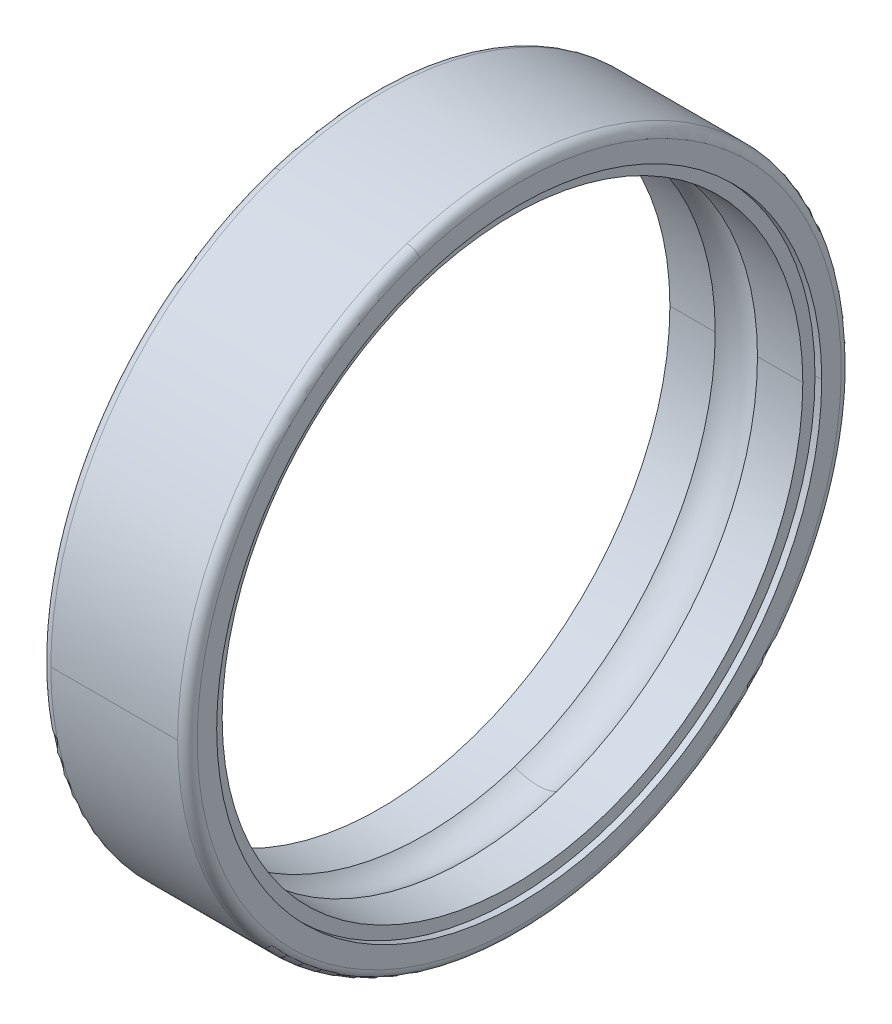
ISO-10303-21;
HEADER;
FILE_DESCRIPTION(('STEP AP214'),'2;1');
FILE_NAME('part.step','',(''),(''),'','','');
FILE_SCHEMA(('AUTOMOTIVE_DESIGN { 1 0 10303 214 1 1 1 1 }'));
ENDSEC;
DATA;
#1=APPLICATION_CONTEXT('core data for automotive mechanical design processes');
#2=APPLICATION_PROTOCOL_DEFINITION('international standard','automotive_design',2000,#1);
#3=PRODUCT_CONTEXT('',#1,'mechanical');
#4=PRODUCT('Part','Part','',(#3));
#5=PRODUCT_RELATED_PRODUCT_CATEGORY('part','',(#4));
#6=PRODUCT_DEFINITION_FORMATION('','',#4);
#7=PRODUCT_DEFINITION_CONTEXT('part definition',#1,'design');
#8=PRODUCT_DEFINITION('design','',#6,#7);
#9=PRODUCT_DEFINITION_SHAPE('','',#8);
#10=(LENGTH_UNIT() NAMED_UNIT(*) SI_UNIT(.MILLI.,.METRE.));
#11=(NAMED_UNIT(*) PLANE_ANGLE_UNIT() SI_UNIT($,.RADIAN.));
#12=(NAMED_UNIT(*) SI_UNIT($,.STERADIAN.) SOLID_ANGLE_UNIT());
#13=UNCERTAINTY_MEASURE_WITH_UNIT(LENGTH_MEASURE(1.E-05),#10,'distance_accuracy_value','');
#14=(GEOMETRIC_REPRESENTATION_CONTEXT(3) GLOBAL_UNCERTAINTY_ASSIGNED_CONTEXT((#13)) GLOBAL_UNIT_ASSIGNED_CONTEXT((#10,
#11,#12)) REPRESENTATION_CONTEXT('',''));
#15=CARTESIAN_POINT('',(0.,0.,0.));
#16=DIRECTION('',(0.,0.,1.));
#17=DIRECTION('',(1.,0.,0.));
#18=AXIS2_PLACEMENT_3D('',#15,#16,#17);
#19=CARTESIAN_POINT('',(0.,33.,0.));
#20=DIRECTION('',(-1.,0.,0.));
#21=DIRECTION('',(0.,0.,1.));
#22=AXIS2_PLACEMENT_3D('',#19,#20,#21);
#23=PLANE('',#22);
#24=CARTESIAN_POINT('',(0.,0.,0.));
#25=DIRECTION('',(1.,0.,0.));
#26=DIRECTION('',(0.,0.,-1.));
#27=AXIS2_PLACEMENT_3D('',#24,#25,#26);
#28=CIRCLE('',#27,31.);
#29=CARTESIAN_POINT('',(0.,0.,-31.));
#30=VERTEX_POINT('',#29);
#31=CARTESIAN_POINT('',(0.,0.,31.));
#32=VERTEX_POINT('',#31);
#33=EDGE_CURVE('E13',#30,#32,#28,.T.);
#34=ORIENTED_EDGE('',*,*,#33,.T.);
#35=CARTESIAN_POINT('',(0.,0.,0.));
#36=DIRECTION('',(1.,0.,0.));
#37=DIRECTION('',(0.,0.,-1.));
#38=AXIS2_PLACEMENT_3D('',#35,#36,#37);
#39=CIRCLE('',#38,31.);
#40=EDGE_CURVE('E34',#32,#30,#39,.T.);
#41=ORIENTED_EDGE('',*,*,#40,.T.);
#42=EDGE_LOOP('',(#34,#41));
#43=FACE_BOUND('',#42,.T.);
#44=CARTESIAN_POINT('',(0.,31.3848650377408,10.1975608143736));
#45=CARTESIAN_POINT('',(0.,31.2180185639359,10.7110985257335));
#46=CARTESIAN_POINT('',(0.,31.0385469803069,11.2205330654713));
#47=CARTESIAN_POINT('',(0.,30.6548330203618,12.2299864190368));
#48=CARTESIAN_POINT('',(0.,30.4505906440456,12.7300052328645));
#49=CARTESIAN_POINT('',(0.,30.0178145256868,13.7194177519436));
#50=CARTESIAN_POINT('',(0.,29.7892807836441,14.208811457195));
#51=CARTESIAN_POINT('',(0.,29.3084758706913,15.1757960512468));
#52=CARTESIAN_POINT('',(0.,29.0562046997811,15.6533869400472));
#53=CARTESIAN_POINT('',(0.,28.5285317670248,16.5956149987527));
#54=CARTESIAN_POINT('',(0.,28.2531300051786,17.0602521686579));
#55=CARTESIAN_POINT('',(0.,27.6798596001222,17.9754535301508));
#56=CARTESIAN_POINT('',(0.,27.3819909569119,18.4260177217386));
#57=CARTESIAN_POINT('',(0.,26.7645043157732,19.3119876532849));
#58=CARTESIAN_POINT('',(0.,26.4448863178447,19.7473933932434));
#59=CARTESIAN_POINT('',(0.,25.78467097244,20.6019974975876));
#60=CARTESIAN_POINT('',(0.,25.4440736249638,21.0211958619732));
#61=CARTESIAN_POINT('',(0.,24.7427201046393,21.8423753278201));
#62=CARTESIAN_POINT('',(0.,24.3819639317911,22.2443564292815));
#63=CARTESIAN_POINT('',(0.,23.6411618551919,23.0301329620725));
#64=CARTESIAN_POINT('',(0.,23.2611159514411,23.4139283934021));
#65=CARTESIAN_POINT('',(0.,22.4826499765719,24.1624089889918));
#66=CARTESIAN_POINT('',(0.,22.0842299054536,24.5270941532518));
#67=CARTESIAN_POINT('',(0.,21.2699754247881,25.2364756562329));
#68=CARTESIAN_POINT('',(0.,20.8541410152409,25.581171994954));
#69=CARTESIAN_POINT('',(0.,20.006059639209,26.2497454431765));
#70=CARTESIAN_POINT('',(0.,19.5738126727243,26.5736225526778));
#71=CARTESIAN_POINT('',(0.,18.6939475036264,27.1997772941379));
#72=CARTESIAN_POINT('',(0.,18.2463293010132,27.5020549260968));
#73=CARTESIAN_POINT('',(0.,17.3368000111135,28.0842824991796));
#74=CARTESIAN_POINT('',(0.,16.874888923827,28.3642324403035));
#75=CARTESIAN_POINT('',(0.,15.9378866488489,28.9011302077878));
#76=CARTESIAN_POINT('',(0.,15.4627954611573,29.1580780341482));
#77=CARTESIAN_POINT('',(0.,14.5005775216534,29.6483525622856));
#78=CARTESIAN_POINT('',(0.,14.0134507698409,29.8816792640626));
#79=CARTESIAN_POINT('',(0.,13.0283352331075,30.3241494385718));
#80=CARTESIAN_POINT('',(0.,12.5303464481866,30.5332929113039));
#81=CARTESIAN_POINT('',(0.,11.5247065438378,30.9268927827787));
#82=CARTESIAN_POINT('',(0.,11.0170554244099,31.1113491815213));
#83=CARTESIAN_POINT('',(0.,9.99331382705881,31.455130533396));
#84=CARTESIAN_POINT('',(0.,9.47722334913565,31.614455486528));
#85=CARTESIAN_POINT('',(0.,8.43784634195957,31.9075901194143));
#86=CARTESIAN_POINT('',(0.,7.91455981270665,32.0413997991685));
#87=CARTESIAN_POINT('',(0.,6.86205134595449,32.2831815260601));
#88=CARTESIAN_POINT('',(0.,6.33282940845526,32.3911535731975));
#89=CARTESIAN_POINT('',(0.,5.2697250672123,32.5809999207369));
#90=CARTESIAN_POINT('',(0.,4.73584266346856,32.6628742211388));
#91=CARTESIAN_POINT('',(0.,3.66470355920979,32.8003278328461));
#92=CARTESIAN_POINT('',(0.,3.12744685869475,32.8559071441515));
#93=CARTESIAN_POINT('',(0.,2.05085345934303,32.9406368822366));
#94=CARTESIAN_POINT('',(0.,1.51151676050634,32.9697873090163));
#95=CARTESIAN_POINT('',(0.,0.432062673859152,33.0015890521187));
#96=CARTESIAN_POINT('',(0.,-0.108054713951354,33.0042403684414));
#97=CARTESIAN_POINT('',(0.,-1.18776898845026,32.9830375033765));
#98=CARTESIAN_POINT('',(0.,-1.72736587513866,32.9591833219889));
#99=CARTESIAN_POINT('',(0.,-2.80473921123023,32.8850269283157));
#100=CARTESIAN_POINT('',(0.,-3.34251566063339,32.8347247160302));
#101=CARTESIAN_POINT('',(0.,-4.4149525715842,32.7077934429965));
#102=CARTESIAN_POINT('',(0.,-4.94961303313185,32.6311643822484));
#103=CARTESIAN_POINT('',(0.,-6.01452992448905,32.4517640184088));
#104=CARTESIAN_POINT('',(0.,-6.5447863542986,32.3489927153173));
#105=CARTESIAN_POINT('',(0.,-7.59961774799521,32.1175554518618));
#106=CARTESIAN_POINT('',(0.,-8.12419271188227,31.9888894914979));
#107=CARTESIAN_POINT('',(0.,-9.16639742669854,31.7059728810658));
#108=CARTESIAN_POINT('',(0.,-9.68402717762776,31.5517222309976));
#109=CARTESIAN_POINT('',(0.,-10.7110944511194,31.218007844484));
#110=CARTESIAN_POINT('',(0.,-11.2205319736818,31.0385441080385));
#111=CARTESIAN_POINT('',(0.,-12.2299875108264,30.6548358926303));
#112=CARTESIAN_POINT('',(0.,-12.7300055254086,30.4505914136676));
#113=CARTESIAN_POINT('',(0.,-13.7194174593994,30.0178137560648));
#114=CARTESIAN_POINT('',(0.,-14.208811378808,29.7892805774245));
#115=CARTESIAN_POINT('',(0.,-15.1757961296337,29.3084760769109));
#116=CARTESIAN_POINT('',(0.,-15.6533869610509,29.0562047550375));
#117=CARTESIAN_POINT('',(0.,-16.595614977749,28.5285317117684));
#118=CARTESIAN_POINT('',(0.,-17.0602521630299,28.2531299903727));
#119=CARTESIAN_POINT('',(0.,-17.9754535357787,27.6798596149281));
#120=CARTESIAN_POINT('',(0.,-18.4260177232465,27.3819909608792));
#121=CARTESIAN_POINT('',(0.,-19.3119876517769,26.764504311806));
#122=CARTESIAN_POINT('',(0.,-19.7473933928393,26.4448863167817));
#123=CARTESIAN_POINT('',(0.,-20.6019974979916,25.7846709735031));
#124=CARTESIAN_POINT('',(0.,-21.0211958620814,25.4440736252487));
#125=CARTESIAN_POINT('',(0.,-21.8423753277118,24.7427201043545));
#126=CARTESIAN_POINT('',(0.,-22.2443564292524,24.3819639317148));
#127=CARTESIAN_POINT('',(0.,-23.0301329621015,23.6411618552683));
#128=CARTESIAN_POINT('',(0.,-23.4139283934099,23.2611159514616));
#129=CARTESIAN_POINT('',(0.,-24.162408988984,22.4826499765515));
#130=CARTESIAN_POINT('',(0.,-24.5270941532497,22.0842299054481));
#131=CARTESIAN_POINT('',(0.,-25.236475656235,21.2699754247936));
#132=CARTESIAN_POINT('',(0.,-25.5811719949546,20.8541410152424));
#133=CARTESIAN_POINT('',(0.,-26.2497454431759,20.0060596392076));
#134=CARTESIAN_POINT('',(0.,-26.5736225526776,19.5738126727239));
#135=CARTESIAN_POINT('',(0.,-27.1997772941381,18.6939475036268));
#136=CARTESIAN_POINT('',(0.,-27.5020549260968,18.2463293010134));
#137=CARTESIAN_POINT('',(0.,-28.0842824991795,17.3368000111134));
#138=CARTESIAN_POINT('',(0.,-28.3642324403035,16.874888923827));
#139=CARTESIAN_POINT('',(0.,-28.9011302077878,15.937886648849));
#140=CARTESIAN_POINT('',(0.,-29.1580780341482,15.4627954611574));
#141=CARTESIAN_POINT('',(0.,-29.6483525622856,14.5005775216534));
#142=CARTESIAN_POINT('',(0.,-29.8816792640626,14.0134507698409));
#143=CARTESIAN_POINT('',(0.,-30.3241494385718,13.0283352331075));
#144=CARTESIAN_POINT('',(0.,-30.533292911304,12.5303464481866));
#145=CARTESIAN_POINT('',(0.,-30.9268927827786,11.5247065438378));
#146=CARTESIAN_POINT('',(0.,-31.1113491815209,11.01705542441));
#147=CARTESIAN_POINT('',(0.,-31.4551305333964,9.99331382705873));
#148=CARTESIAN_POINT('',(0.,-31.6144554865295,9.47722334913527));
#149=CARTESIAN_POINT('',(0.,-31.9075901194127,8.43784634196001));
#150=CARTESIAN_POINT('',(0.,-32.0413997991628,7.91455981270822));
#151=CARTESIAN_POINT('',(0.,-32.2831815260657,6.86205134595299));
#152=CARTESIAN_POINT('',(0.,-32.3911535732186,6.33282940844957));
#153=CARTESIAN_POINT('',(0.,-32.5809999207158,5.26972506721806));
#154=CARTESIAN_POINT('',(0.,-32.66287422106,4.73584266348998));
#155=CARTESIAN_POINT('',(0.,-32.8003278329249,3.66470355918842));
#156=CARTESIAN_POINT('',(0.,-32.8559071444456,3.12744685861494));
#157=CARTESIAN_POINT('',(0.,-32.9406368819425,2.05085345942288));
#158=CARTESIAN_POINT('',(0.,-32.9697873079188,1.5115167608043));
#159=CARTESIAN_POINT('',(0.,-33.0015890532162,0.432062673561257));
#160=CARTESIAN_POINT('',(0.,-33.0042403725373,-0.108054715063203));
#161=CARTESIAN_POINT('',(0.,-32.9830374992805,-1.18776898733835));
#162=CARTESIAN_POINT('',(0.,-32.9591833067027,-1.72736587098903));
#163=CARTESIAN_POINT('',(0.,-32.885026943602,-2.8047392153798));
#164=CARTESIAN_POINT('',(0.,-32.8347247730792,-3.34251567611988));
#165=CARTESIAN_POINT('',(0.,-32.7077933859475,-4.41495255609767));
#166=CARTESIAN_POINT('',(0.,-32.6311641693385,-4.94961297533538));
#167=CARTESIAN_POINT('',(0.,-32.4517642313186,-6.01452998228548));
#168=CARTESIAN_POINT('',(0.,-32.3489935099077,-6.54478656999788));
#169=CARTESIAN_POINT('',(0.,-32.1175546572714,-7.59961753229588));
#170=CARTESIAN_POINT('',(0.,-31.9888865260461,-8.12419190688149));
#171=CARTESIAN_POINT('',(0.,-31.7059758465176,-9.16639823169926));
#172=CARTESIAN_POINT('',(0.,-31.5517332982145,-9.68403018193142));
#173=CARTESIAN_POINT('',(0.,-31.3848650377408,-10.1975608143735));
#174=B_SPLINE_CURVE_WITH_KNOTS('',3,(#44,#45,#46,#47,#48,#49,#50,#51,#52,#53,#54,#55,#56,#57,
#58,#59,#60,#61,#62,#63,#64,#65,#66,#67,#68,#69,#70,#71,#72,#73,#74,#75,#76,#77,#78,#79,#80,#81,
#82,#83,#84,#85,#86,#87,#88,#89,#90,#91,#92,#93,#94,#95,#96,#97,#98,#99,#100,#101,#102,#103,
#104,#105,#106,#107,#108,#109,#110,#111,#112,#113,#114,#115,#116,#117,#118,#119,#120,#121,#122,
#123,#124,#125,#126,#127,#128,#129,#130,#131,#132,#133,#134,#135,#136,#137,#138,#139,#140,#141,
#142,#143,#144,#145,#146,#147,#148,#149,#150,#151,#152,#153,#154,#155,#156,#157,#158,#159,#160,
#161,#162,#163,#164,#165,#166,#167,#168,#169,#170,#171,#172,#173),.UNSPECIFIED.,.F.,.F.,(4,2,2,
2,2,2,2,2,2,2,2,2,2,2,2,2,2,2,2,2,2,2,2,2,2,2,2,2,2,2,2,2,2,2,2,2,2,2,2,2,2,2,2,2,2,2,2,2,2,2,2,
2,2,2,2,2,2,2,2,2,2,2,2,2,4),(0.,1.61972108251224,3.2394421650245,4.85916324753675,
6.478884330049,8.09860541256124,9.7183264950735,11.3380475775857,12.957768660098,
14.5774897426102,16.1972108251225,17.8169319076348,19.436652990147,21.0563740726592,
22.6760951551715,24.2958162376837,25.915537320196,27.5352584027082,29.1549794852205,
30.7747005677327,32.394421650245,34.0141427327572,35.6338638152695,37.2535848977817,
38.873305980294,40.4930270628062,42.1127481453185,43.7324692278307,45.352190310343,
46.9719113928552,48.5916324753675,50.2113535578797,51.831074640392,53.4507957229042,
55.0705168054165,56.6902378879287,58.309958970441,59.9296800529532,61.5494011354655,
63.1691222179777,64.78884330049,66.4085643830022,68.0282854655145,69.6480065480267,
71.267727630539,72.8874487130512,74.5071697955635,76.1268908780757,77.7466119605879,
79.3663330431002,80.9860541256125,82.6057752081247,84.225496290637,85.8452173731492,
87.4649384556615,89.0846595381737,90.704380620686,92.3241017031982,93.9438227857105,
95.5635438682227,97.183264950735,98.8029860332473,100.42270711576,102.042428198272,
103.662149280784),.UNSPECIFIED.);
#175=CARTESIAN_POINT('',(0.,31.3848650377408,10.1975608143735));
#176=VERTEX_POINT('',#175);
#177=CARTESIAN_POINT('',(0.,-31.3848650377408,-10.1975608143735));
#178=VERTEX_POINT('',#177);
#179=EDGE_CURVE('E326',#176,#178,#174,.T.);
#180=ORIENTED_EDGE('',*,*,#179,.F.);
#181=CARTESIAN_POINT('',(0.,-31.3848650377408,-10.1975608143736));
#182=CARTESIAN_POINT('',(0.,-31.2180185639359,-10.7110985257335));
#183=CARTESIAN_POINT('',(0.,-31.0385469803069,-11.2205330654713));
#184=CARTESIAN_POINT('',(0.,-30.6548330203618,-12.2299864190368));
#185=CARTESIAN_POINT('',(0.,-30.4505906440456,-12.7300052328645));
#186=CARTESIAN_POINT('',(0.,-30.0178145256868,-13.7194177519436));
#187=CARTESIAN_POINT('',(0.,-29.7892807836441,-14.208811457195));
#188=CARTESIAN_POINT('',(0.,-29.3084758706913,-15.1757960512468));
#189=CARTESIAN_POINT('',(0.,-29.0562046997811,-15.6533869400472));
#190=CARTESIAN_POINT('',(0.,-28.5285317670248,-16.5956149987527));
#191=CARTESIAN_POINT('',(0.,-28.2531300051786,-17.0602521686578));
#192=CARTESIAN_POINT('',(0.,-27.6798596001222,-17.9754535301507));
#193=CARTESIAN_POINT('',(0.,-27.3819909569119,-18.4260177217385));
#194=CARTESIAN_POINT('',(0.,-26.7645043157732,-19.3119876532849));
#195=CARTESIAN_POINT('',(0.,-26.4448863178447,-19.7473933932434));
#196=CARTESIAN_POINT('',(0.,-25.78467097244,-20.6019974975875));
#197=CARTESIAN_POINT('',(0.,-25.4440736249638,-21.0211958619732));
#198=CARTESIAN_POINT('',(0.,-24.7427201046393,-21.8423753278201));
#199=CARTESIAN_POINT('',(0.,-24.3819639317911,-22.2443564292815));
#200=CARTESIAN_POINT('',(0.,-23.6411618551919,-23.0301329620725));
#201=CARTESIAN_POINT('',(0.,-23.2611159514411,-23.4139283934021));
#202=CARTESIAN_POINT('',(0.,-22.4826499765719,-24.1624089889918));
#203=CARTESIAN_POINT('',(0.,-22.0842299054536,-24.5270941532518));
#204=CARTESIAN_POINT('',(0.,-21.2699754247881,-25.2364756562329));
#205=CARTESIAN_POINT('',(0.,-20.8541410152409,-25.581171994954));
#206=CARTESIAN_POINT('',(0.,-20.006059639209,-26.2497454431765));
#207=CARTESIAN_POINT('',(0.,-19.5738126727243,-26.5736225526778));
#208=CARTESIAN_POINT('',(0.,-18.6939475036264,-27.1997772941379));
#209=CARTESIAN_POINT('',(0.,-18.2463293010133,-27.5020549260967));
#210=CARTESIAN_POINT('',(0.,-17.3368000111135,-28.0842824991796));
#211=CARTESIAN_POINT('',(0.,-16.874888923827,-28.3642324403035));
#212=CARTESIAN_POINT('',(0.,-15.9378866488489,-28.9011302077878));
#213=CARTESIAN_POINT('',(0.,-15.4627954611574,-29.1580780341482));
#214=CARTESIAN_POINT('',(0.,-14.5005775216534,-29.6483525622856));
#215=CARTESIAN_POINT('',(0.,-14.0134507698409,-29.8816792640626));
#216=CARTESIAN_POINT('',(0.,-13.0283352331075,-30.3241494385718));
#217=CARTESIAN_POINT('',(0.,-12.5303464481866,-30.5332929113039));
#218=CARTESIAN_POINT('',(0.,-11.5247065438378,-30.9268927827787));
#219=CARTESIAN_POINT('',(0.,-11.0170554244099,-31.1113491815213));
#220=CARTESIAN_POINT('',(0.,-9.99331382705884,-31.455130533396));
#221=CARTESIAN_POINT('',(0.,-9.47722334913568,-31.614455486528));
#222=CARTESIAN_POINT('',(0.,-8.4378463419596,-31.9075901194143));
#223=CARTESIAN_POINT('',(0.,-7.91455981270668,-32.0413997991685));
#224=CARTESIAN_POINT('',(0.,-6.86205134595453,-32.2831815260601));
#225=CARTESIAN_POINT('',(0.,-6.3328294084553,-32.3911535731975));
#226=CARTESIAN_POINT('',(0.,-5.26972506721234,-32.5809999207369));
#227=CARTESIAN_POINT('',(0.,-4.73584266346861,-32.6628742211388));
#228=CARTESIAN_POINT('',(0.,-3.66470355920984,-32.8003278328461));
#229=CARTESIAN_POINT('',(0.,-3.1274468586948,-32.8559071441515));
#230=CARTESIAN_POINT('',(0.,-2.05085345934307,-32.9406368822366));
#231=CARTESIAN_POINT('',(0.,-1.51151676050638,-32.9697873090163));
#232=CARTESIAN_POINT('',(0.,-0.43206267385919,-33.0015890521187));
#233=CARTESIAN_POINT('',(0.,0.108054713951311,-33.0042403684414));
#234=CARTESIAN_POINT('',(0.,1.18776898845021,-32.9830375033765));
#235=CARTESIAN_POINT('',(0.,1.72736587513861,-32.9591833219889));
#236=CARTESIAN_POINT('',(0.,2.80473921123017,-32.8850269283157));
#237=CARTESIAN_POINT('',(0.,3.34251566063333,-32.8347247160302));
#238=CARTESIAN_POINT('',(0.,4.41495257158414,-32.7077934429965));
#239=CARTESIAN_POINT('',(0.,4.94961303313179,-32.6311643822484));
#240=CARTESIAN_POINT('',(0.,6.01452992448899,-32.4517640184088));
#241=CARTESIAN_POINT('',(0.,6.54478635429854,-32.3489927153173));
#242=CARTESIAN_POINT('',(0.,7.59961774799515,-32.1175554518619));
#243=CARTESIAN_POINT('',(0.,8.12419271188221,-31.9888894914979));
#244=CARTESIAN_POINT('',(0.,9.16639742669848,-31.7059728810658));
#245=CARTESIAN_POINT('',(0.,9.6840271776277,-31.5517222309977));
#246=CARTESIAN_POINT('',(0.,10.7110944511193,-31.218007844484));
#247=CARTESIAN_POINT('',(0.,11.2205319736817,-31.0385441080385));
#248=CARTESIAN_POINT('',(0.,12.2299875108263,-30.6548358926303));
#249=CARTESIAN_POINT('',(0.,12.7300055254086,-30.4505914136677));
#250=CARTESIAN_POINT('',(0.,13.7194174593994,-30.0178137560648));
#251=CARTESIAN_POINT('',(0.,14.2088113788079,-29.7892805774245));
#252=CARTESIAN_POINT('',(0.,15.1757961296337,-29.3084760769109));
#253=CARTESIAN_POINT('',(0.,15.6533869610509,-29.0562047550376));
#254=CARTESIAN_POINT('',(0.,16.5956149777489,-28.5285317117685));
#255=CARTESIAN_POINT('',(0.,17.0602521630298,-28.2531299903727));
#256=CARTESIAN_POINT('',(0.,17.9754535357786,-27.6798596149281));
#257=CARTESIAN_POINT('',(0.,18.4260177232465,-27.3819909608792));
#258=CARTESIAN_POINT('',(0.,19.3119876517768,-26.764504311806));
#259=CARTESIAN_POINT('',(0.,19.7473933928393,-26.4448863167818));
#260=CARTESIAN_POINT('',(0.,20.6019974979915,-25.7846709735031));
#261=CARTESIAN_POINT('',(0.,21.0211958620813,-25.4440736252487));
#262=CARTESIAN_POINT('',(0.,21.8423753277118,-24.7427201043546));
#263=CARTESIAN_POINT('',(0.,22.2443564292524,-24.3819639317148));
#264=CARTESIAN_POINT('',(0.,23.0301329621014,-23.6411618552683));
#265=CARTESIAN_POINT('',(0.,23.4139283934098,-23.2611159514616));
#266=CARTESIAN_POINT('',(0.,24.1624089889839,-22.4826499765515));
#267=CARTESIAN_POINT('',(0.,24.5270941532496,-22.0842299054482));
#268=CARTESIAN_POINT('',(0.,25.2364756562349,-21.2699754247937));
#269=CARTESIAN_POINT('',(0.,25.5811719949545,-20.8541410152425));
#270=CARTESIAN_POINT('',(0.,26.2497454431758,-20.0060596392076));
#271=CARTESIAN_POINT('',(0.,26.5736225526776,-19.573812672724));
#272=CARTESIAN_POINT('',(0.,27.199777294138,-18.6939475036269));
#273=CARTESIAN_POINT('',(0.,27.5020549260967,-18.2463293010135));
#274=CARTESIAN_POINT('',(0.,28.0842824991795,-17.3368000111135));
#275=CARTESIAN_POINT('',(0.,28.3642324403035,-16.8748889238271));
#276=CARTESIAN_POINT('',(0.,28.9011302077878,-15.937886648849));
#277=CARTESIAN_POINT('',(0.,29.1580780341481,-15.4627954611575));
#278=CARTESIAN_POINT('',(0.,29.6483525622855,-14.5005775216535));
#279=CARTESIAN_POINT('',(0.,29.8816792640625,-14.013450769841));
#280=CARTESIAN_POINT('',(0.,30.3241494385718,-13.0283352331076));
#281=CARTESIAN_POINT('',(0.,30.533292911304,-12.5303464481867));
#282=CARTESIAN_POINT('',(0.,30.9268927827785,-11.5247065438379));
#283=CARTESIAN_POINT('',(0.,31.1113491815208,-11.0170554244101));
#284=CARTESIAN_POINT('',(0.,31.4551305333963,-9.99331382705881));
#285=CARTESIAN_POINT('',(0.,31.6144554865295,-9.47722334913536));
#286=CARTESIAN_POINT('',(0.,31.9075901194127,-8.4378463419601));
#287=CARTESIAN_POINT('',(0.,32.0413997991628,-7.9145598127083));
#288=CARTESIAN_POINT('',(0.,32.2831815260657,-6.86205134595308));
#289=CARTESIAN_POINT('',(0.,32.3911535732186,-6.33282940844966));
#290=CARTESIAN_POINT('',(0.,32.5809999207158,-5.26972506721816));
#291=CARTESIAN_POINT('',(0.,32.66287422106,-4.73584266349009));
#292=CARTESIAN_POINT('',(0.,32.8003278329249,-3.66470355918854));
#293=CARTESIAN_POINT('',(0.,32.8559071444455,-3.12744685861506));
#294=CARTESIAN_POINT('',(0.,32.9406368819425,-2.050853459423));
#295=CARTESIAN_POINT('',(0.,32.9697873079188,-1.51151676080442));
#296=CARTESIAN_POINT('',(0.,33.0015890532162,-0.432062673561377));
#297=CARTESIAN_POINT('',(0.,33.0042403725373,0.108054715063082));
#298=CARTESIAN_POINT('',(0.,32.9830374992806,1.18776898733822));
#299=CARTESIAN_POINT('',(0.,32.9591833067027,1.72736587098891));
#300=CARTESIAN_POINT('',(0.,32.885026943602,2.80473921537968));
#301=CARTESIAN_POINT('',(0.,32.8347247730792,3.34251567611976));
#302=CARTESIAN_POINT('',(0.,32.7077933859475,4.41495255609755));
#303=CARTESIAN_POINT('',(0.,32.6311641693385,4.94961297533526));
#304=CARTESIAN_POINT('',(0.,32.4517642313186,6.01452998228536));
#305=CARTESIAN_POINT('',(0.,32.3489935099077,6.54478656999776));
#306=CARTESIAN_POINT('',(0.,32.1175546572715,7.59961753229576));
#307=CARTESIAN_POINT('',(0.,31.9888865260461,8.12419190688137));
#308=CARTESIAN_POINT('',(0.,31.7059758465176,9.16639823169914));
#309=CARTESIAN_POINT('',(0.,31.5517332982145,9.68403018193131));
#310=CARTESIAN_POINT('',(0.,31.3848650377409,10.1975608143734));
#311=B_SPLINE_CURVE_WITH_KNOTS('',3,(#181,#182,#183,#184,#185,#186,#187,#188,#189,#190,#191,
#192,#193,#194,#195,#196,#197,#198,#199,#200,#201,#202,#203,#204,#205,#206,#207,#208,#209,#210,
#211,#212,#213,#214,#215,#216,#217,#218,#219,#220,#221,#222,#223,#224,#225,#226,#227,#228,#229,
#230,#231,#232,#233,#234,#235,#236,#237,#238,#239,#240,#241,#242,#243,#244,#245,#246,#247,#248,
#249,#250,#251,#252,#253,#254,#255,#256,#257,#258,#259,#260,#261,#262,#263,#264,#265,#266,#267,
#268,#269,#270,#271,#272,#273,#274,#275,#276,#277,#278,#279,#280,#281,#282,#283,#284,#285,#286,
#287,#288,#289,#290,#291,#292,#293,#294,#295,#296,#297,#298,#299,#300,#301,#302,#303,#304,#305,
#306,#307,#308,#309,#310),.UNSPECIFIED.,.F.,.F.,(4,2,2,2,2,2,2,2,2,2,2,2,2,2,2,2,2,2,2,2,2,2,2,
2,2,2,2,2,2,2,2,2,2,2,2,2,2,2,2,2,2,2,2,2,2,2,2,2,2,2,2,2,2,2,2,2,2,2,2,2,2,2,2,2,4),(0.,
1.61972108251224,3.2394421650245,4.85916324753674,6.47888433004899,8.09860541256124,
9.71832649507349,11.3380475775857,12.957768660098,14.5774897426102,16.1972108251225,
17.8169319076347,19.436652990147,21.0563740726592,22.6760951551715,24.2958162376837,
25.915537320196,27.5352584027082,29.1549794852205,30.7747005677327,32.394421650245,
34.0141427327572,35.6338638152694,37.2535848977817,38.8733059802939,40.4930270628062,
42.1127481453184,43.7324692278307,45.3521903103429,46.9719113928552,48.5916324753674,
50.2113535578797,51.8310746403919,53.4507957229042,55.0705168054164,56.6902378879287,
58.3099589704409,59.9296800529531,61.5494011354654,63.1691222179776,64.7888433004899,
66.4085643830021,68.0282854655144,69.6480065480266,71.2677276305389,72.8874487130511,
74.5071697955634,76.1268908780756,77.7466119605879,79.3663330431001,80.9860541256124,
82.6057752081246,84.2254962906369,85.8452173731491,87.4649384556614,89.0846595381736,
90.7043806206859,92.3241017031981,93.9438227857103,95.5635438682226,97.1832649507349,
98.8029860332471,100.422707115759,102.042428198272,103.662149280784),.UNSPECIFIED.);
#312=EDGE_CURVE('E428',#178,#176,#311,.T.);
#313=ORIENTED_EDGE('',*,*,#312,.F.);
#314=EDGE_LOOP('',(#180,#313));
#315=FACE_BOUND('',#314,.T.);
#316=ADVANCED_FACE('F25',(#43,#315),#23,.T.);
#317=CARTESIAN_POINT('',(0.999999999999218,0.,0.));
#318=DIRECTION('',(1.,0.,0.));
#319=DIRECTION('',(0.,-0.309016994374947,0.951056516295154));
#320=AXIS2_PLACEMENT_3D('',#317,#318,#319);
#321=TOROIDAL_SURFACE('',#320,33.0000000000008,0.999999999999217);
#322=CARTESIAN_POINT('',(0.999999999999218,-31.3848650377408,-10.1975608143735));
#323=DIRECTION('',(0.,0.309016994374948,-0.951056516295153));
#324=DIRECTION('',(7.81819053941645E-13,-0.951056516295153,-0.309016994374948));
#325=AXIS2_PLACEMENT_3D('',#322,#323,#324);
#326=CIRCLE('',#325,0.99999999999922);
#327=CARTESIAN_POINT('',(1.,-32.3359215540352,-10.5065778087482));
#328=VERTEX_POINT('',#327);
#329=EDGE_CURVE('E391',#328,#178,#326,.T.);
#330=ORIENTED_EDGE('',*,*,#329,.T.);
#331=ORIENTED_EDGE('',*,*,#312,.T.);
#332=CARTESIAN_POINT('',(0.999999999999218,31.3848650377408,10.1975608143735));
#333=DIRECTION('',(0.,-0.309016994374948,0.951056516295153));
#334=DIRECTION('',(7.81819053941645E-13,0.951056516295153,0.309016994374948));
#335=AXIS2_PLACEMENT_3D('',#332,#333,#334);
#336=CIRCLE('',#335,0.99999999999922);
#337=CARTESIAN_POINT('',(1.,32.3359215540352,10.5065778087482));
#338=VERTEX_POINT('',#337);
#339=EDGE_CURVE('E387',#338,#176,#336,.T.);
#340=ORIENTED_EDGE('',*,*,#339,.F.);
#341=CARTESIAN_POINT('',(1.,0.,0.));
#342=DIRECTION('',(1.,0.,0.));
#343=DIRECTION('',(0.,0.,-1.));
#344=AXIS2_PLACEMENT_3D('',#341,#342,#343);
#345=CIRCLE('',#344,34.);
#346=CARTESIAN_POINT('',(1.,0.,-34.));
#347=VERTEX_POINT('',#346);
#348=EDGE_CURVE('E382',#347,#338,#345,.T.);
#349=ORIENTED_EDGE('',*,*,#348,.F.);
#350=CARTESIAN_POINT('',(1.,0.,0.));
#351=DIRECTION('',(1.,0.,0.));
#352=DIRECTION('',(0.,0.,-1.));
#353=AXIS2_PLACEMENT_3D('',#350,#351,#352);
#354=CIRCLE('',#353,34.);
#355=EDGE_CURVE('E377',#328,#347,#354,.T.);
#356=ORIENTED_EDGE('',*,*,#355,.F.);
#357=EDGE_LOOP('',(#330,#331,#340,#349,#356));
#358=FACE_BOUND('',#357,.T.);
#359=ADVANCED_FACE('F399',(#358),#321,.T.);
#360=CARTESIAN_POINT('',(15.,0.,0.));
#361=DIRECTION('',(1.,0.,0.));
#362=DIRECTION('',(0.,1.,0.));
#363=AXIS2_PLACEMENT_3D('',#360,#361,#362);
#364=CYLINDRICAL_SURFACE('',#363,34.);
#365=DIRECTION('',(1.,0.,0.));
#366=VECTOR('',#365,1.);
#367=CARTESIAN_POINT('',(1.,0.,34.));
#368=LINE('',#367,#366);
#369=CARTESIAN_POINT('',(1.,0.,34.));
#370=VERTEX_POINT('',#369);
#371=CARTESIAN_POINT('',(14.,0.,34.));
#372=VERTEX_POINT('',#371);
#373=EDGE_CURVE('E372',#370,#372,#368,.T.);
#374=ORIENTED_EDGE('',*,*,#373,.F.);
#375=CARTESIAN_POINT('',(1.,0.,0.));
#376=DIRECTION('',(1.,0.,0.));
#377=DIRECTION('',(0.,0.,-1.));
#378=AXIS2_PLACEMENT_3D('',#375,#376,#377);
#379=CIRCLE('',#378,34.);
#380=EDGE_CURVE('E367',#370,#328,#379,.T.);
#381=ORIENTED_EDGE('',*,*,#380,.T.);
#382=ORIENTED_EDGE('',*,*,#355,.T.);
#383=DIRECTION('',(1.,0.,0.));
#384=VECTOR('',#383,1.);
#385=CARTESIAN_POINT('',(1.,0.,-34.));
#386=LINE('',#385,#384);
#387=CARTESIAN_POINT('',(14.,0.,-34.));
#388=VERTEX_POINT('',#387);
#389=EDGE_CURVE('E363',#347,#388,#386,.T.);
#390=ORIENTED_EDGE('',*,*,#389,.T.);
#391=CARTESIAN_POINT('',(14.,0.,0.));
#392=DIRECTION('',(1.,0.,0.));
#393=DIRECTION('',(0.,0.,-1.));
#394=AXIS2_PLACEMENT_3D('',#391,#392,#393);
#395=CIRCLE('',#394,34.);
#396=CARTESIAN_POINT('',(14.,-32.3359215540352,-10.5065778087482));
#397=VERTEX_POINT('',#396);
#398=EDGE_CURVE('E358',#397,#388,#395,.T.);
#399=ORIENTED_EDGE('',*,*,#398,.F.);
#400=CARTESIAN_POINT('',(14.,0.,0.));
#401=DIRECTION('',(1.,0.,0.));
#402=DIRECTION('',(0.,0.,-1.));
#403=AXIS2_PLACEMENT_3D('',#400,#401,#402);
#404=CIRCLE('',#403,34.);
#405=EDGE_CURVE('E353',#372,#397,#404,.T.);
#406=ORIENTED_EDGE('',*,*,#405,.F.);
#407=EDGE_LOOP('',(#374,#381,#382,#390,#399,#406));
#408=FACE_BOUND('',#407,.T.);
#409=ADVANCED_FACE('F408',(#408),#364,.T.);
#410=CARTESIAN_POINT('',(14.0000000000015,0.,0.));
#411=DIRECTION('',(1.,0.,0.));
#412=DIRECTION('',(0.,0.309016994374947,-0.951056516295154));
#413=AXIS2_PLACEMENT_3D('',#410,#411,#412);
#414=TOROIDAL_SURFACE('',#413,33.0000000000015,0.999999999998448);
#415=CARTESIAN_POINT('',(14.0000000000015,-31.3848650377415,-10.1975608143737));
#416=DIRECTION('',(0.,0.309016994374947,-0.951056516295154));
#417=DIRECTION('',(1.,0.,0.));
#418=AXIS2_PLACEMENT_3D('',#415,#416,#417);
#419=CIRCLE('',#418,0.999999999998447);
#420=CARTESIAN_POINT('',(15.,-31.3848650377415,-10.1975608143737));
#421=VERTEX_POINT('',#420);
#422=EDGE_CURVE('E349',#421,#397,#419,.T.);
#423=ORIENTED_EDGE('',*,*,#422,.F.);
#424=CARTESIAN_POINT('',(15.,0.,0.));
#425=DIRECTION('',(1.,0.,0.));
#426=DIRECTION('',(0.,0.,-1.));
#427=AXIS2_PLACEMENT_3D('',#424,#425,#426);
#428=CIRCLE('',#427,33.);
#429=CARTESIAN_POINT('',(15.,31.3848650377415,10.1975608143737));
#430=VERTEX_POINT('',#429);
#431=EDGE_CURVE('E344',#430,#421,#428,.T.);
#432=ORIENTED_EDGE('',*,*,#431,.F.);
#433=CARTESIAN_POINT('',(14.0000000000015,31.3848650377415,10.1975608143737));
#434=DIRECTION('',(0.,-0.309016994374947,0.951056516295154));
#435=DIRECTION('',(1.,0.,0.));
#436=AXIS2_PLACEMENT_3D('',#433,#434,#435);
#437=CIRCLE('',#436,0.999999999998447);
#438=CARTESIAN_POINT('',(14.,32.3359215540352,10.5065778087482));
#439=VERTEX_POINT('',#438);
#440=EDGE_CURVE('E340',#430,#439,#437,.T.);
#441=ORIENTED_EDGE('',*,*,#440,.T.);
#442=CARTESIAN_POINT('',(14.,0.,0.));
#443=DIRECTION('',(1.,0.,0.));
#444=DIRECTION('',(0.,0.,-1.));
#445=AXIS2_PLACEMENT_3D('',#442,#443,#444);
#446=CIRCLE('',#445,34.);
#447=EDGE_CURVE('E335',#439,#372,#446,.T.);
#448=ORIENTED_EDGE('',*,*,#447,.T.);
#449=ORIENTED_EDGE('',*,*,#405,.T.);
#450=EDGE_LOOP('',(#423,#432,#441,#448,#449));
#451=FACE_BOUND('',#450,.T.);
#452=ADVANCED_FACE('F412',(#451),#414,.T.);
#453=CARTESIAN_POINT('',(15.,0.,0.));
#454=DIRECTION('',(1.,0.,0.));
#455=DIRECTION('',(0.,-1.,0.));
#456=AXIS2_PLACEMENT_3D('',#453,#454,#455);
#457=CYLINDRICAL_SURFACE('',#456,34.);
#458=ORIENTED_EDGE('',*,*,#373,.T.);
#459=ORIENTED_EDGE('',*,*,#447,.F.);
#460=CARTESIAN_POINT('',(14.,0.,0.));
#461=DIRECTION('',(1.,0.,0.));
#462=DIRECTION('',(0.,0.,-1.));
#463=AXIS2_PLACEMENT_3D('',#460,#461,#462);
#464=CIRCLE('',#463,34.);
#465=EDGE_CURVE('E330',#388,#439,#464,.T.);
#466=ORIENTED_EDGE('',*,*,#465,.F.);
#467=ORIENTED_EDGE('',*,*,#389,.F.);
#468=ORIENTED_EDGE('',*,*,#348,.T.);
#469=CARTESIAN_POINT('',(1.,0.,0.));
#470=DIRECTION('',(1.,0.,0.));
#471=DIRECTION('',(0.,0.,-1.));
#472=AXIS2_PLACEMENT_3D('',#469,#470,#471);
#473=CIRCLE('',#472,34.);
#474=EDGE_CURVE('E327',#338,#370,#473,.T.);
#475=ORIENTED_EDGE('',*,*,#474,.T.);
#476=EDGE_LOOP('',(#458,#459,#466,#467,#468,#475));
#477=FACE_BOUND('',#476,.T.);
#478=ADVANCED_FACE('F415',(#477),#457,.T.);
#479=CARTESIAN_POINT('',(0.999999999999218,0.,0.));
#480=DIRECTION('',(1.,0.,0.));
#481=DIRECTION('',(0.,0.309016994374947,-0.951056516295154));
#482=AXIS2_PLACEMENT_3D('',#479,#480,#481);
#483=TOROIDAL_SURFACE('',#482,33.0000000000008,0.999999999999217);
#484=ORIENTED_EDGE('',*,*,#329,.F.);
#485=ORIENTED_EDGE('',*,*,#380,.F.);
#486=ORIENTED_EDGE('',*,*,#474,.F.);
#487=ORIENTED_EDGE('',*,*,#339,.T.);
#488=ORIENTED_EDGE('',*,*,#179,.T.);
#489=EDGE_LOOP('',(#484,#485,#486,#487,#488));
#490=FACE_BOUND('',#489,.T.);
#491=ADVANCED_FACE('F297',(#490),#483,.T.);
#492=CARTESIAN_POINT('',(14.0000000000015,0.,0.));
#493=DIRECTION('',(1.,0.,0.));
#494=DIRECTION('',(0.,-0.309016994374947,0.951056516295154));
#495=AXIS2_PLACEMENT_3D('',#492,#493,#494);
#496=TOROIDAL_SURFACE('',#495,33.0000000000015,0.999999999998448);
#497=ORIENTED_EDGE('',*,*,#422,.T.);
#498=ORIENTED_EDGE('',*,*,#398,.T.);
#499=ORIENTED_EDGE('',*,*,#465,.T.);
#500=ORIENTED_EDGE('',*,*,#440,.F.);
#501=CARTESIAN_POINT('',(15.,-31.3848650377401,-10.1975608143733));
#502=CARTESIAN_POINT('',(15.,-29.7829708706698,-15.1274377583063));
#503=CARTESIAN_POINT('',(15.,-27.2134963155414,-19.7430824909133));
#504=CARTESIAN_POINT('',(15.,-23.7570266490261,-23.7898703999657));
#505=CARTESIAN_POINT('',(15.,-15.4436685104376,-30.3098944982613));
#506=CARTESIAN_POINT('',(15.,-5.28238229571895,-33.2032017963762));
#507=CARTESIAN_POINT('',(15.,0.0232253073785618,-33.6207712179262));
#508=CARTESIAN_POINT('',(15.,10.5120070629435,-32.3526310802914));
#509=CARTESIAN_POINT('',(15.,19.7430038242275,-27.2134267724514));
#510=CARTESIAN_POINT('',(15.,23.7898893928228,-23.7570481105347));
#511=CARTESIAN_POINT('',(15.,30.3098992650561,-15.4436591550762));
#512=CARTESIAN_POINT('',(15.,33.2031732699296,-5.28237954493305));
#513=CARTESIAN_POINT('',(15.,33.6208737185858,0.0232025410955021));
#514=CARTESIAN_POINT('',(15.,32.9866143966507,5.26763681941692));
#515=CARTESIAN_POINT('',(15.,31.3848650377401,10.1975608143733));
#516=B_SPLINE_CURVE_WITH_KNOTS('',5,(#501,#502,#503,#504,#505,#506,#507,#508,#509,#510,#511,
#512,#513,#514,#515),.UNSPECIFIED.,.F.,.F.,(6,3,3,3,6),(0.,0.785398163397448,1.5707963267949,
2.35619449019234,3.14159265358979),.UNSPECIFIED.);
#517=EDGE_CURVE('E271',#421,#430,#516,.T.);
#518=ORIENTED_EDGE('',*,*,#517,.F.);
#519=EDGE_LOOP('',(#497,#498,#499,#500,#518));
#520=FACE_BOUND('',#519,.T.);
#521=ADVANCED_FACE('F291',(#520),#496,.T.);
#522=CARTESIAN_POINT('',(15.,31.,0.));
#523=DIRECTION('',(1.,0.,0.));
#524=DIRECTION('',(0.,0.,-1.));
#525=AXIS2_PLACEMENT_3D('',#522,#523,#524);
#526=PLANE('',#525);
#527=ORIENTED_EDGE('',*,*,#431,.T.);
#528=ORIENTED_EDGE('',*,*,#517,.T.);
#529=EDGE_LOOP('',(#527,#528));
#530=FACE_BOUND('',#529,.T.);
#531=CARTESIAN_POINT('',(15.,0.,0.));
#532=DIRECTION('',(1.,0.,0.));
#533=DIRECTION('',(0.,0.,-1.));
#534=AXIS2_PLACEMENT_3D('',#531,#532,#533);
#535=CIRCLE('',#534,31.);
#536=CARTESIAN_POINT('',(15.,0.,31.));
#537=VERTEX_POINT('',#536);
#538=CARTESIAN_POINT('',(15.,0.,-31.));
#539=VERTEX_POINT('',#538);
#540=EDGE_CURVE('E266',#537,#539,#535,.T.);
#541=ORIENTED_EDGE('',*,*,#540,.F.);
#542=CARTESIAN_POINT('',(15.,0.,0.));
#543=DIRECTION('',(1.,0.,0.));
#544=DIRECTION('',(0.,0.,-1.));
#545=AXIS2_PLACEMENT_3D('',#542,#543,#544);
#546=CIRCLE('',#545,31.);
#547=EDGE_CURVE('E261',#539,#537,#546,.T.);
#548=ORIENTED_EDGE('',*,*,#547,.F.);
#549=EDGE_LOOP('',(#541,#548));
#550=FACE_BOUND('',#549,.T.);
#551=ADVANCED_FACE('F280',(#530,#550),#526,.T.);
#552=CARTESIAN_POINT('',(15.,0.,0.));
#553=DIRECTION('',(1.,0.,0.));
#554=DIRECTION('',(0.,-1.,0.));
#555=AXIS2_PLACEMENT_3D('',#552,#553,#554);
#556=CYLINDRICAL_SURFACE('',#555,31.);
#557=DIRECTION('',(1.,0.,0.));
#558=VECTOR('',#557,1.);
#559=CARTESIAN_POINT('',(14.31,0.,31.));
#560=LINE('',#559,#558);
#561=CARTESIAN_POINT('',(14.31,0.,31.));
#562=VERTEX_POINT('',#561);
#563=EDGE_CURVE('E256',#562,#537,#560,.T.);
#564=ORIENTED_EDGE('',*,*,#563,.F.);
#565=CARTESIAN_POINT('',(14.31,0.,0.));
#566=DIRECTION('',(1.,0.,0.));
#567=DIRECTION('',(0.,0.,-1.));
#568=AXIS2_PLACEMENT_3D('',#565,#566,#567);
#569=CIRCLE('',#568,31.);
#570=CARTESIAN_POINT('',(14.31,0.,-31.));
#571=VERTEX_POINT('',#570);
#572=EDGE_CURVE('E251',#571,#562,#569,.T.);
#573=ORIENTED_EDGE('',*,*,#572,.F.);
#574=DIRECTION('',(1.,0.,0.));
#575=VECTOR('',#574,1.);
#576=CARTESIAN_POINT('',(14.31,0.,-31.));
#577=LINE('',#576,#575);
#578=EDGE_CURVE('E246',#571,#539,#577,.T.);
#579=ORIENTED_EDGE('',*,*,#578,.T.);
#580=ORIENTED_EDGE('',*,*,#547,.T.);
#581=EDGE_LOOP('',(#564,#573,#579,#580));
#582=FACE_BOUND('',#581,.T.);
#583=ADVANCED_FACE('F290',(#582),#556,.F.);
#584=CARTESIAN_POINT('',(15.,0.,0.));
#585=DIRECTION('',(1.,0.,0.));
#586=DIRECTION('',(0.,1.,0.));
#587=AXIS2_PLACEMENT_3D('',#584,#585,#586);
#588=CYLINDRICAL_SURFACE('',#587,31.);
#589=ORIENTED_EDGE('',*,*,#563,.T.);
#590=ORIENTED_EDGE('',*,*,#540,.T.);
#591=ORIENTED_EDGE('',*,*,#578,.F.);
#592=CARTESIAN_POINT('',(14.31,0.,0.));
#593=DIRECTION('',(1.,0.,0.));
#594=DIRECTION('',(0.,0.,-1.));
#595=AXIS2_PLACEMENT_3D('',#592,#593,#594);
#596=CIRCLE('',#595,31.);
#597=EDGE_CURVE('E241',#562,#571,#596,.T.);
#598=ORIENTED_EDGE('',*,*,#597,.F.);
#599=EDGE_LOOP('',(#589,#590,#591,#598));
#600=FACE_BOUND('',#599,.T.);
#601=ADVANCED_FACE('F459',(#600),#588,.F.);
#602=CARTESIAN_POINT('',(14.31,29.75,0.));
#603=DIRECTION('',(1.,0.,0.));
#604=DIRECTION('',(0.,0.,-1.));
#605=AXIS2_PLACEMENT_3D('',#602,#603,#604);
#606=PLANE('',#605);
#607=ORIENTED_EDGE('',*,*,#572,.T.);
#608=ORIENTED_EDGE('',*,*,#597,.T.);
#609=EDGE_LOOP('',(#607,#608));
#610=FACE_BOUND('',#609,.T.);
#611=CARTESIAN_POINT('',(14.31,0.,0.));
#612=DIRECTION('',(1.,0.,0.));
#613=DIRECTION('',(0.,0.,-1.));
#614=AXIS2_PLACEMENT_3D('',#611,#612,#613);
#615=CIRCLE('',#614,29.75);
#616=CARTESIAN_POINT('',(14.31,0.,29.75));
#617=VERTEX_POINT('',#616);
#618=CARTESIAN_POINT('',(14.31,0.,-29.75));
#619=VERTEX_POINT('',#618);
#620=EDGE_CURVE('E236',#617,#619,#615,.T.);
#621=ORIENTED_EDGE('',*,*,#620,.F.);
#622=CARTESIAN_POINT('',(14.31,0.,0.));
#623=DIRECTION('',(1.,0.,0.));
#624=DIRECTION('',(0.,0.,-1.));
#625=AXIS2_PLACEMENT_3D('',#622,#623,#624);
#626=CIRCLE('',#625,29.75);
#627=EDGE_CURVE('E231',#619,#617,#626,.T.);
#628=ORIENTED_EDGE('',*,*,#627,.F.);
#629=EDGE_LOOP('',(#621,#628));
#630=FACE_BOUND('',#629,.T.);
#631=ADVANCED_FACE('F462',(#610,#630),#606,.T.);
#632=CARTESIAN_POINT('',(15.,0.,0.));
#633=DIRECTION('',(1.,0.,0.));
#634=DIRECTION('',(0.,-1.,0.));
#635=AXIS2_PLACEMENT_3D('',#632,#633,#634);
#636=CYLINDRICAL_SURFACE('',#635,29.75);
#637=DIRECTION('',(1.,0.,0.));
#638=VECTOR('',#637,1.);
#639=CARTESIAN_POINT('',(9.6650635094611,0.,29.75));
#640=LINE('',#639,#638);
#641=CARTESIAN_POINT('',(9.6650635094611,0.,29.75));
#642=VERTEX_POINT('',#641);
#643=EDGE_CURVE('E226',#642,#617,#640,.T.);
#644=ORIENTED_EDGE('',*,*,#643,.F.);
#645=CARTESIAN_POINT('',(9.6650635094611,0.,0.));
#646=DIRECTION('',(1.,0.,0.));
#647=DIRECTION('',(0.,0.,-1.));
#648=AXIS2_PLACEMENT_3D('',#645,#646,#647);
#649=CIRCLE('',#648,29.75);
#650=CARTESIAN_POINT('',(9.6650635094611,28.2939313597808,9.19325558265468));
#651=VERTEX_POINT('',#650);
#652=EDGE_CURVE('E221',#651,#642,#649,.T.);
#653=ORIENTED_EDGE('',*,*,#652,.F.);
#654=CARTESIAN_POINT('',(9.6650635094611,0.,0.));
#655=DIRECTION('',(1.,0.,0.));
#656=DIRECTION('',(0.,0.,-1.));
#657=AXIS2_PLACEMENT_3D('',#654,#655,#656);
#658=CIRCLE('',#657,29.75);
#659=CARTESIAN_POINT('',(9.6650635094611,0.,-29.75));
#660=VERTEX_POINT('',#659);
#661=EDGE_CURVE('E216',#660,#651,#658,.T.);
#662=ORIENTED_EDGE('',*,*,#661,.F.);
#663=DIRECTION('',(1.,0.,0.));
#664=VECTOR('',#663,1.);
#665=CARTESIAN_POINT('',(9.6650635094611,0.,-29.75));
#666=LINE('',#665,#664);
#667=EDGE_CURVE('E211',#660,#619,#666,.T.);
#668=ORIENTED_EDGE('',*,*,#667,.T.);
#669=ORIENTED_EDGE('',*,*,#627,.T.);
#670=EDGE_LOOP('',(#644,#653,#662,#668,#669));
#671=FACE_BOUND('',#670,.T.);
#672=ADVANCED_FACE('F465',(#671),#636,.F.);
#673=CARTESIAN_POINT('',(15.,0.,0.));
#674=DIRECTION('',(1.,0.,0.));
#675=DIRECTION('',(0.,1.,0.));
#676=AXIS2_PLACEMENT_3D('',#673,#674,#675);
#677=CYLINDRICAL_SURFACE('',#676,29.75);
#678=ORIENTED_EDGE('',*,*,#643,.T.);
#679=ORIENTED_EDGE('',*,*,#620,.T.);
#680=ORIENTED_EDGE('',*,*,#667,.F.);
#681=CARTESIAN_POINT('',(9.6650635094611,0.,0.));
#682=DIRECTION('',(1.,0.,0.));
#683=DIRECTION('',(0.,0.,-1.));
#684=AXIS2_PLACEMENT_3D('',#681,#682,#683);
#685=CIRCLE('',#684,29.75);
#686=CARTESIAN_POINT('',(9.6650635094611,-28.2939313597808,-9.19325558265468));
#687=VERTEX_POINT('',#686);
#688=EDGE_CURVE('E206',#687,#660,#685,.T.);
#689=ORIENTED_EDGE('',*,*,#688,.F.);
#690=CARTESIAN_POINT('',(9.6650635094611,0.,0.));
#691=DIRECTION('',(1.,0.,0.));
#692=DIRECTION('',(0.,0.,-1.));
#693=AXIS2_PLACEMENT_3D('',#690,#691,#692);
#694=CIRCLE('',#693,29.75);
#695=EDGE_CURVE('E201',#642,#687,#694,.T.);
#696=ORIENTED_EDGE('',*,*,#695,.F.);
#697=EDGE_LOOP('',(#678,#679,#680,#689,#696));
#698=FACE_BOUND('',#697,.T.);
#699=ADVANCED_FACE('F470',(#698),#677,.F.);
#700=CARTESIAN_POINT('',(7.5,0.,0.));
#701=DIRECTION('',(1.,0.,0.));
#702=DIRECTION('',(0.,0.309016994374947,-0.951056516295154));
#703=AXIS2_PLACEMENT_3D('',#700,#701,#702);
#704=TOROIDAL_SURFACE('',#703,27.,3.5);
#705=CARTESIAN_POINT('',(7.5,-25.6785259399691,-8.34345884812357));
#706=DIRECTION('',(0.,0.309016994374947,-0.951056516295154));
#707=DIRECTION('',(0.618589574131742,-0.747258691374764,-0.242799067008887));
#708=AXIS2_PLACEMENT_3D('',#705,#706,#707);
#709=CIRCLE('',#708,3.5);
#710=CARTESIAN_POINT('',(5.33493649053889,-28.2939313597808,-9.19325558265468));
#711=VERTEX_POINT('',#710);
#712=EDGE_CURVE('E197',#687,#711,#709,.T.);
#713=ORIENTED_EDGE('',*,*,#712,.T.);
#714=CARTESIAN_POINT('',(5.3349364905389,0.,0.));
#715=DIRECTION('',(1.,0.,0.));
#716=DIRECTION('',(0.,0.,-1.));
#717=AXIS2_PLACEMENT_3D('',#714,#715,#716);
#718=CIRCLE('',#717,29.75);
#719=CARTESIAN_POINT('',(5.3349364905389,0.,29.75));
#720=VERTEX_POINT('',#719);
#721=EDGE_CURVE('E192',#720,#711,#718,.T.);
#722=ORIENTED_EDGE('',*,*,#721,.F.);
#723=CARTESIAN_POINT('',(5.3349364905389,0.,0.));
#724=DIRECTION('',(1.,0.,0.));
#725=DIRECTION('',(0.,0.,-1.));
#726=AXIS2_PLACEMENT_3D('',#723,#724,#725);
#727=CIRCLE('',#726,29.75);
#728=CARTESIAN_POINT('',(5.3349364905389,28.2939313597808,9.19325558265468));
#729=VERTEX_POINT('',#728);
#730=EDGE_CURVE('E187',#729,#720,#727,.T.);
#731=ORIENTED_EDGE('',*,*,#730,.F.);
#732=CARTESIAN_POINT('',(7.5,25.6785259399691,8.34345884812358));
#733=DIRECTION('',(0.,-0.309016994374948,0.951056516295154));
#734=DIRECTION('',(0.618589574131742,0.747258691374764,0.242799067008887));
#735=AXIS2_PLACEMENT_3D('',#732,#733,#734);
#736=CIRCLE('',#735,3.5);
#737=EDGE_CURVE('E182',#651,#729,#736,.T.);
#738=ORIENTED_EDGE('',*,*,#737,.F.);
#739=ORIENTED_EDGE('',*,*,#652,.T.);
#740=ORIENTED_EDGE('',*,*,#695,.T.);
#741=EDGE_LOOP('',(#713,#722,#731,#738,#739,#740));
#742=FACE_BOUND('',#741,.T.);
#743=ADVANCED_FACE('F477',(#742),#704,.F.);
#744=CARTESIAN_POINT('',(7.5,0.,0.));
#745=DIRECTION('',(1.,0.,0.));
#746=DIRECTION('',(0.,-0.309016994374947,0.951056516295154));
#747=AXIS2_PLACEMENT_3D('',#744,#745,#746);
#748=TOROIDAL_SURFACE('',#747,27.,3.5);
#749=ORIENTED_EDGE('',*,*,#712,.F.);
#750=ORIENTED_EDGE('',*,*,#688,.T.);
#751=ORIENTED_EDGE('',*,*,#661,.T.);
#752=ORIENTED_EDGE('',*,*,#737,.T.);
#753=CARTESIAN_POINT('',(5.3349364905389,0.,0.));
#754=DIRECTION('',(1.,0.,0.));
#755=DIRECTION('',(0.,0.,-1.));
#756=AXIS2_PLACEMENT_3D('',#753,#754,#755);
#757=CIRCLE('',#756,29.75);
#758=CARTESIAN_POINT('',(5.3349364905389,0.,-29.75));
#759=VERTEX_POINT('',#758);
#760=EDGE_CURVE('E177',#759,#729,#757,.T.);
#761=ORIENTED_EDGE('',*,*,#760,.F.);
#762=CARTESIAN_POINT('',(5.3349364905389,0.,0.));
#763=DIRECTION('',(1.,0.,0.));
#764=DIRECTION('',(0.,0.,-1.));
#765=AXIS2_PLACEMENT_3D('',#762,#763,#764);
#766=CIRCLE('',#765,29.75);
#767=EDGE_CURVE('E172',#711,#759,#766,.T.);
#768=ORIENTED_EDGE('',*,*,#767,.F.);
#769=EDGE_LOOP('',(#749,#750,#751,#752,#761,#768));
#770=FACE_BOUND('',#769,.T.);
#771=ADVANCED_FACE('F474',(#770),#748,.F.);
#772=CARTESIAN_POINT('',(15.,0.,0.));
#773=DIRECTION('',(1.,0.,0.));
#774=DIRECTION('',(0.,1.,0.));
#775=AXIS2_PLACEMENT_3D('',#772,#773,#774);
#776=CYLINDRICAL_SURFACE('',#775,29.75);
#777=DIRECTION('',(1.,0.,0.));
#778=VECTOR('',#777,1.);
#779=CARTESIAN_POINT('',(0.689999999999998,0.,29.75));
#780=LINE('',#779,#778);
#781=CARTESIAN_POINT('',(0.689999999999998,0.,29.75));
#782=VERTEX_POINT('',#781);
#783=EDGE_CURVE('E167',#782,#720,#780,.T.);
#784=ORIENTED_EDGE('',*,*,#783,.T.);
#785=ORIENTED_EDGE('',*,*,#721,.T.);
#786=ORIENTED_EDGE('',*,*,#767,.T.);
#787=DIRECTION('',(1.,0.,0.));
#788=VECTOR('',#787,1.);
#789=CARTESIAN_POINT('',(0.69,0.,-29.75));
#790=LINE('',#789,#788);
#791=CARTESIAN_POINT('',(0.69,0.,-29.75));
#792=VERTEX_POINT('',#791);
#793=EDGE_CURVE('E162',#792,#759,#790,.T.);
#794=ORIENTED_EDGE('',*,*,#793,.F.);
#795=CARTESIAN_POINT('',(0.69,0.,0.));
#796=DIRECTION('',(1.,0.,0.));
#797=DIRECTION('',(0.,0.,-1.));
#798=AXIS2_PLACEMENT_3D('',#795,#796,#797);
#799=CIRCLE('',#798,29.75);
#800=EDGE_CURVE('E151',#782,#792,#799,.T.);
#801=ORIENTED_EDGE('',*,*,#800,.F.);
#802=EDGE_LOOP('',(#784,#785,#786,#794,#801));
#803=FACE_BOUND('',#802,.T.);
#804=ADVANCED_FACE('F481',(#803),#776,.F.);
#805=CARTESIAN_POINT('',(0.69,31.,0.));
#806=DIRECTION('',(-1.,0.,0.));
#807=DIRECTION('',(0.,0.,1.));
#808=AXIS2_PLACEMENT_3D('',#805,#806,#807);
#809=PLANE('',#808);
#810=CARTESIAN_POINT('',(0.69,0.,0.));
#811=DIRECTION('',(1.,0.,0.));
#812=DIRECTION('',(0.,0.,-1.));
#813=AXIS2_PLACEMENT_3D('',#810,#811,#812);
#814=CIRCLE('',#813,29.75);
#815=EDGE_CURVE('E148',#792,#782,#814,.T.);
#816=ORIENTED_EDGE('',*,*,#815,.T.);
#817=ORIENTED_EDGE('',*,*,#800,.T.);
#818=EDGE_LOOP('',(#816,#817));
#819=FACE_BOUND('',#818,.T.);
#820=CARTESIAN_POINT('',(0.69,0.,0.));
#821=DIRECTION('',(1.,0.,0.));
#822=DIRECTION('',(0.,0.,-1.));
#823=AXIS2_PLACEMENT_3D('',#820,#821,#822);
#824=CIRCLE('',#823,31.);
#825=CARTESIAN_POINT('',(0.69,0.,31.));
#826=VERTEX_POINT('',#825);
#827=CARTESIAN_POINT('',(0.69,0.,-31.));
#828=VERTEX_POINT('',#827);
#829=EDGE_CURVE('E136',#826,#828,#824,.T.);
#830=ORIENTED_EDGE('',*,*,#829,.F.);
#831=CARTESIAN_POINT('',(0.69,0.,0.));
#832=DIRECTION('',(1.,0.,0.));
#833=DIRECTION('',(0.,0.,-1.));
#834=AXIS2_PLACEMENT_3D('',#831,#832,#833);
#835=CIRCLE('',#834,31.);
#836=EDGE_CURVE('E132',#828,#826,#835,.T.);
#837=ORIENTED_EDGE('',*,*,#836,.F.);
#838=EDGE_LOOP('',(#830,#837));
#839=FACE_BOUND('',#838,.T.);
#840=ADVANCED_FACE('F134',(#819,#839),#809,.T.);
#841=CARTESIAN_POINT('',(15.,0.,0.));
#842=DIRECTION('',(1.,0.,0.));
#843=DIRECTION('',(0.,-1.,0.));
#844=AXIS2_PLACEMENT_3D('',#841,#842,#843);
#845=CYLINDRICAL_SURFACE('',#844,31.);
#846=DIRECTION('',(1.,0.,0.));
#847=VECTOR('',#846,1.);
#848=CARTESIAN_POINT('',(0.,0.,31.));
#849=LINE('',#848,#847);
#850=EDGE_CURVE('E140',#32,#826,#849,.T.);
#851=ORIENTED_EDGE('',*,*,#850,.F.);
#852=ORIENTED_EDGE('',*,*,#33,.F.);
#853=DIRECTION('',(1.,0.,0.));
#854=VECTOR('',#853,1.);
#855=CARTESIAN_POINT('',(0.,0.,-31.));
#856=LINE('',#855,#854);
#857=EDGE_CURVE('E143',#30,#828,#856,.T.);
#858=ORIENTED_EDGE('',*,*,#857,.T.);
#859=ORIENTED_EDGE('',*,*,#836,.T.);
#860=EDGE_LOOP('',(#851,#852,#858,#859));
#861=FACE_BOUND('',#860,.T.);
#862=ADVANCED_FACE('F144',(#861),#845,.F.);
#863=CARTESIAN_POINT('',(15.,0.,0.));
#864=DIRECTION('',(1.,0.,0.));
#865=DIRECTION('',(0.,1.,0.));
#866=AXIS2_PLACEMENT_3D('',#863,#864,#865);
#867=CYLINDRICAL_SURFACE('',#866,31.);
#868=ORIENTED_EDGE('',*,*,#850,.T.);
#869=ORIENTED_EDGE('',*,*,#829,.T.);
#870=ORIENTED_EDGE('',*,*,#857,.F.);
#871=ORIENTED_EDGE('',*,*,#40,.F.);
#872=EDGE_LOOP('',(#868,#869,#870,#871));
#873=FACE_BOUND('',#872,.T.);
#874=ADVANCED_FACE('F147',(#873),#867,.F.);
#875=CARTESIAN_POINT('',(15.,0.,0.));
#876=DIRECTION('',(1.,0.,0.));
#877=DIRECTION('',(0.,-1.,0.));
#878=AXIS2_PLACEMENT_3D('',#875,#876,#877);
#879=CYLINDRICAL_SURFACE('',#878,29.75);
#880=ORIENTED_EDGE('',*,*,#783,.F.);
#881=ORIENTED_EDGE('',*,*,#815,.F.);
#882=ORIENTED_EDGE('',*,*,#793,.T.);
#883=ORIENTED_EDGE('',*,*,#760,.T.);
#884=ORIENTED_EDGE('',*,*,#730,.T.);
#885=EDGE_LOOP('',(#880,#881,#882,#883,#884));
#886=FACE_BOUND('',#885,.T.);
#887=ADVANCED_FACE('F484',(#886),#879,.F.);
#888=CLOSED_SHELL('',(#316,#359,#409,#452,#478,#491,#521,#551,#583,#601,#631,#672,#699,#743,
#771,#804,#840,#862,#874,#887));
#889=MANIFOLD_SOLID_BREP('B1',#888);
#890=ADVANCED_BREP_SHAPE_REPRESENTATION('',(#18,#889),#14);
#891=SHAPE_DEFINITION_REPRESENTATION(#9,#890);
ENDSEC;
END-ISO-10303-21;
